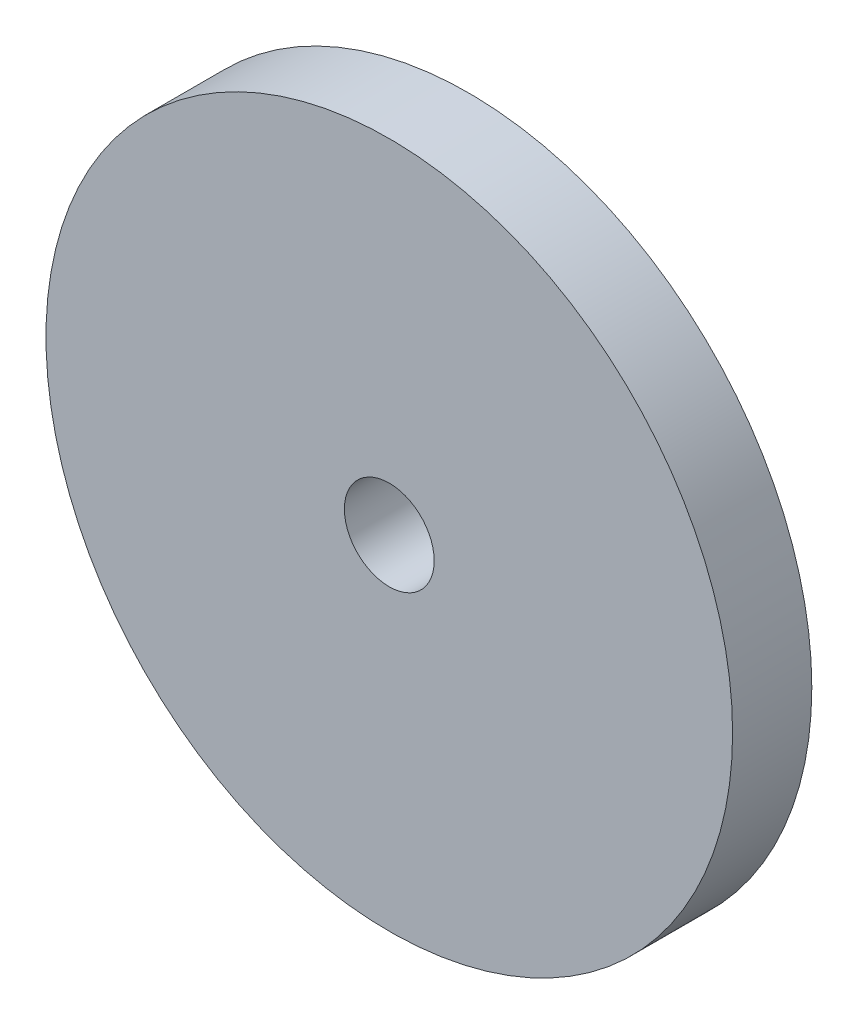
ISO-10303-21;
HEADER;
FILE_DESCRIPTION(('STEP AP214'),'2;1');
FILE_NAME('part.step','',(''),(''),'','','');
FILE_SCHEMA(('AUTOMOTIVE_DESIGN { 1 0 10303 214 1 1 1 1 }'));
ENDSEC;
DATA;
#1=APPLICATION_CONTEXT('core data for automotive mechanical design processes');
#2=APPLICATION_PROTOCOL_DEFINITION('international standard','automotive_design',2000,#1);
#3=PRODUCT_CONTEXT('',#1,'mechanical');
#4=PRODUCT('Part','Part','',(#3));
#5=PRODUCT_RELATED_PRODUCT_CATEGORY('part','',(#4));
#6=PRODUCT_DEFINITION_FORMATION('','',#4);
#7=PRODUCT_DEFINITION_CONTEXT('part definition',#1,'design');
#8=PRODUCT_DEFINITION('design','',#6,#7);
#9=PRODUCT_DEFINITION_SHAPE('','',#8);
#10=(LENGTH_UNIT() NAMED_UNIT(*) SI_UNIT(.MILLI.,.METRE.));
#11=(NAMED_UNIT(*) PLANE_ANGLE_UNIT() SI_UNIT($,.RADIAN.));
#12=(NAMED_UNIT(*) SI_UNIT($,.STERADIAN.) SOLID_ANGLE_UNIT());
#13=UNCERTAINTY_MEASURE_WITH_UNIT(LENGTH_MEASURE(1.E-05),#10,'distance_accuracy_value','');
#14=(GEOMETRIC_REPRESENTATION_CONTEXT(3) GLOBAL_UNCERTAINTY_ASSIGNED_CONTEXT((#13)) GLOBAL_UNIT_ASSIGNED_CONTEXT((#10,
#11,#12)) REPRESENTATION_CONTEXT('',''));
#15=CARTESIAN_POINT('',(0.,0.,0.));
#16=DIRECTION('',(0.,0.,1.));
#17=DIRECTION('',(1.,0.,0.));
#18=AXIS2_PLACEMENT_3D('',#15,#16,#17);
#19=CARTESIAN_POINT('',(-132.499999999985,-1.71267019554307E-11,0.));
#20=DIRECTION('',(0.,0.,1.));
#21=DIRECTION('',(1.,0.,0.));
#22=AXIS2_PLACEMENT_3D('',#19,#20,#21);
#23=PLANE('',#22);
#24=CARTESIAN_POINT('',(-132.499999999985,-1.71267019554307E-11,0.));
#25=DIRECTION('',(0.,0.,1.));
#26=DIRECTION('',(1.,0.,0.));
#27=AXIS2_PLACEMENT_3D('',#24,#25,#26);
#28=CIRCLE('',#27,13.);
#29=CARTESIAN_POINT('',(-119.499999999985,-1.71267019554307E-11,0.));
#30=VERTEX_POINT('',#29);
#31=EDGE_CURVE('E51',#30,#30,#28,.T.);
#32=ORIENTED_EDGE('',*,*,#31,.F.);
#33=EDGE_LOOP('',(#32));
#34=FACE_BOUND('',#33,.T.);
#35=CARTESIAN_POINT('',(-132.500000000808,-1.59052804321991E-11,0.));
#36=DIRECTION('',(0.,0.,1.));
#37=DIRECTION('',(1.,0.,0.));
#38=AXIS2_PLACEMENT_3D('',#35,#36,#37);
#39=CIRCLE('',#38,3.99999999999999);
#40=CARTESIAN_POINT('',(-128.500000000808,-1.59052804321991E-11,0.));
#41=VERTEX_POINT('',#40);
#42=EDGE_CURVE('E43',#41,#41,#39,.F.);
#43=ORIENTED_EDGE('',*,*,#42,.F.);
#44=EDGE_LOOP('',(#43));
#45=FACE_BOUND('',#44,.T.);
#46=ADVANCED_FACE('F36',(#34,#45),#23,.F.);
#47=CARTESIAN_POINT('',(-132.499999999985,-1.71267019554307E-11,3.));
#48=DIRECTION('',(0.,0.,1.));
#49=DIRECTION('',(1.,0.,0.));
#50=AXIS2_PLACEMENT_3D('',#47,#48,#49);
#51=PLANE('',#50);
#52=CARTESIAN_POINT('',(-132.499999999985,-1.71267019554307E-11,3.));
#53=DIRECTION('',(0.,0.,1.));
#54=DIRECTION('',(1.,0.,0.));
#55=AXIS2_PLACEMENT_3D('',#52,#53,#54);
#56=CIRCLE('',#55,13.);
#57=CARTESIAN_POINT('',(-119.499999999985,-1.71267019554307E-11,3.));
#58=VERTEX_POINT('',#57);
#59=EDGE_CURVE('E47',#58,#58,#56,.T.);
#60=ORIENTED_EDGE('',*,*,#59,.T.);
#61=EDGE_LOOP('',(#60));
#62=FACE_BOUND('',#61,.T.);
#63=CARTESIAN_POINT('',(-132.499999999985,-1.71267019554307E-11,3.));
#64=DIRECTION('',(0.,0.,1.));
#65=DIRECTION('',(1.,0.,0.));
#66=AXIS2_PLACEMENT_3D('',#63,#64,#65);
#67=CIRCLE('',#66,1.70000000000001);
#68=CARTESIAN_POINT('',(-130.799999999985,-1.71267019554307E-11,3.));
#69=VERTEX_POINT('',#68);
#70=EDGE_CURVE('E55',#69,#69,#67,.T.);
#71=ORIENTED_EDGE('',*,*,#70,.F.);
#72=EDGE_LOOP('',(#71));
#73=FACE_BOUND('',#72,.T.);
#74=ADVANCED_FACE('F76',(#62,#73),#51,.T.);
#75=CARTESIAN_POINT('',(-132.499999999985,-1.71267019554307E-11,3.));
#76=DIRECTION('',(0.,0.,-1.));
#77=DIRECTION('',(-1.,0.,0.));
#78=AXIS2_PLACEMENT_3D('',#75,#76,#77);
#79=CYLINDRICAL_SURFACE('',#78,13.);
#80=ORIENTED_EDGE('',*,*,#59,.F.);
#81=EDGE_LOOP('',(#80));
#82=FACE_BOUND('',#81,.T.);
#83=ORIENTED_EDGE('',*,*,#31,.T.);
#84=EDGE_LOOP('',(#83));
#85=FACE_BOUND('',#84,.T.);
#86=ADVANCED_FACE('F72',(#82,#85),#79,.T.);
#87=CARTESIAN_POINT('',(-132.499999999985,-1.71267019554307E-11,3.));
#88=DIRECTION('',(0.,0.,-1.));
#89=DIRECTION('',(-1.,0.,0.));
#90=AXIS2_PLACEMENT_3D('',#87,#88,#89);
#91=CYLINDRICAL_SURFACE('',#90,1.70000000000001);
#92=ORIENTED_EDGE('',*,*,#70,.T.);
#93=EDGE_LOOP('',(#92));
#94=FACE_BOUND('',#93,.T.);
#95=CARTESIAN_POINT('',(-132.499999999985,-1.71267019554307E-11,-5.));
#96=DIRECTION('',(0.,0.,-1.));
#97=DIRECTION('',(-1.,0.,0.));
#98=AXIS2_PLACEMENT_3D('',#95,#96,#97);
#99=CIRCLE('',#98,1.70000000000001);
#100=CARTESIAN_POINT('',(-134.199999999985,-1.71267019554307E-11,-5.));
#101=VERTEX_POINT('',#100);
#102=EDGE_CURVE('E59',#101,#101,#99,.T.);
#103=ORIENTED_EDGE('',*,*,#102,.T.);
#104=EDGE_LOOP('',(#103));
#105=FACE_BOUND('',#104,.T.);
#106=ADVANCED_FACE('F63',(#94,#105),#91,.F.);
#107=CARTESIAN_POINT('',(-132.500000000808,-1.59052804321991E-11,-5.));
#108=DIRECTION('',(0.,0.,-1.));
#109=DIRECTION('',(-1.,0.,0.));
#110=AXIS2_PLACEMENT_3D('',#107,#108,#109);
#111=PLANE('',#110);
#112=CARTESIAN_POINT('',(-132.500000000808,-1.59052804321991E-11,-5.));
#113=DIRECTION('',(0.,0.,-1.));
#114=DIRECTION('',(-1.,0.,0.));
#115=AXIS2_PLACEMENT_3D('',#112,#113,#114);
#116=CIRCLE('',#115,2.99999999999998);
#117=CARTESIAN_POINT('',(-135.500000000808,-1.59052804321991E-11,-5.));
#118=VERTEX_POINT('',#117);
#119=EDGE_CURVE('E11',#118,#118,#116,.T.);
#120=ORIENTED_EDGE('',*,*,#119,.T.);
#121=EDGE_LOOP('',(#120));
#122=FACE_BOUND('',#121,.T.);
#123=ORIENTED_EDGE('',*,*,#102,.F.);
#124=EDGE_LOOP('',(#123));
#125=FACE_BOUND('',#124,.T.);
#126=ADVANCED_FACE('F65',(#122,#125),#111,.T.);
#127=CARTESIAN_POINT('',(-132.500000000808,-1.59052804321991E-11,-5.));
#128=DIRECTION('',(0.,0.,1.));
#129=DIRECTION('',(1.,0.,0.));
#130=AXIS2_PLACEMENT_3D('',#127,#128,#129);
#131=CONICAL_SURFACE('',#130,2.99999999999998,0.197395559849878);
#132=ORIENTED_EDGE('',*,*,#42,.T.);
#133=EDGE_LOOP('',(#132));
#134=FACE_BOUND('',#133,.T.);
#135=ORIENTED_EDGE('',*,*,#119,.F.);
#136=EDGE_LOOP('',(#135));
#137=FACE_BOUND('',#136,.T.);
#138=ADVANCED_FACE('F38',(#134,#137),#131,.T.);
#139=CLOSED_SHELL('',(#46,#74,#86,#106,#126,#138));
#140=MANIFOLD_SOLID_BREP('B2',#139);
#141=ADVANCED_BREP_SHAPE_REPRESENTATION('',(#18,#140),#14);
#142=SHAPE_DEFINITION_REPRESENTATION(#9,#141);
ENDSEC;
END-ISO-10303-21;
